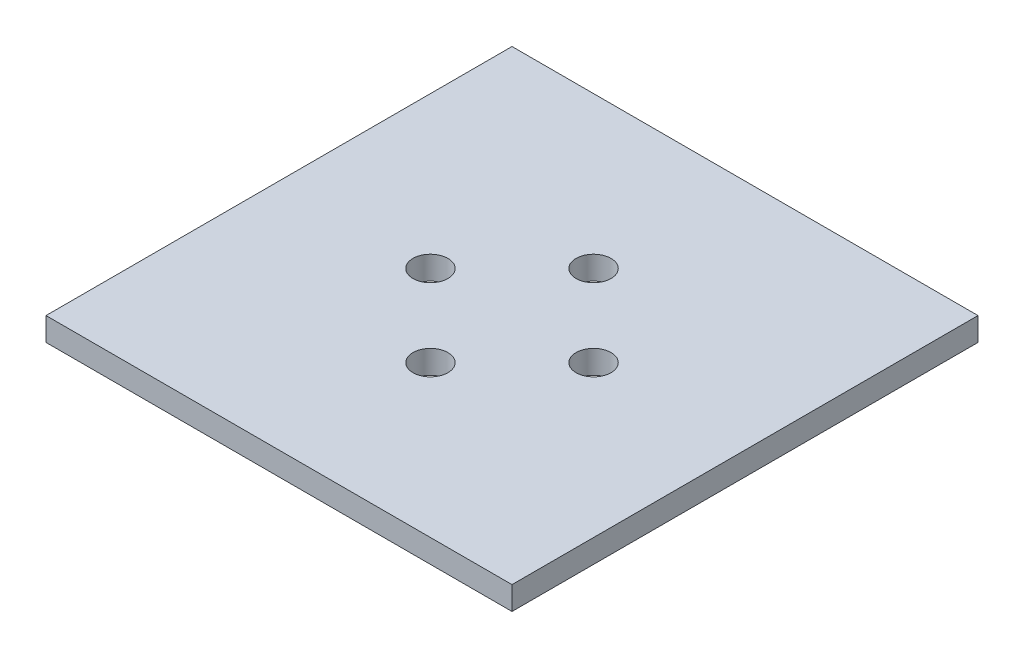
ISO-10303-21;
HEADER;
FILE_DESCRIPTION(('STEP AP214'),'2;1');
FILE_NAME('part.step','',(''),(''),'','','');
FILE_SCHEMA(('AUTOMOTIVE_DESIGN { 1 0 10303 214 1 1 1 1 }'));
ENDSEC;
DATA;
#1=APPLICATION_CONTEXT('core data for automotive mechanical design processes');
#2=APPLICATION_PROTOCOL_DEFINITION('international standard','automotive_design',2000,#1);
#3=PRODUCT_CONTEXT('',#1,'mechanical');
#4=PRODUCT('Part','Part','',(#3));
#5=PRODUCT_RELATED_PRODUCT_CATEGORY('part','',(#4));
#6=PRODUCT_DEFINITION_FORMATION('','',#4);
#7=PRODUCT_DEFINITION_CONTEXT('part definition',#1,'design');
#8=PRODUCT_DEFINITION('design','',#6,#7);
#9=PRODUCT_DEFINITION_SHAPE('','',#8);
#10=(LENGTH_UNIT() NAMED_UNIT(*) SI_UNIT(.MILLI.,.METRE.));
#11=(NAMED_UNIT(*) PLANE_ANGLE_UNIT() SI_UNIT($,.RADIAN.));
#12=(NAMED_UNIT(*) SI_UNIT($,.STERADIAN.) SOLID_ANGLE_UNIT());
#13=UNCERTAINTY_MEASURE_WITH_UNIT(LENGTH_MEASURE(1.E-05),#10,'distance_accuracy_value','');
#14=(GEOMETRIC_REPRESENTATION_CONTEXT(3) GLOBAL_UNCERTAINTY_ASSIGNED_CONTEXT((#13)) GLOBAL_UNIT_ASSIGNED_CONTEXT((#10,
#11,#12)) REPRESENTATION_CONTEXT('',''));
#15=CARTESIAN_POINT('',(0.,0.,0.));
#16=DIRECTION('',(0.,0.,1.));
#17=DIRECTION('',(1.,0.,0.));
#18=AXIS2_PLACEMENT_3D('',#15,#16,#17);
#19=CARTESIAN_POINT('',(0.,2.,0.));
#20=DIRECTION('',(0.,-1.,0.));
#21=DIRECTION('',(0.,0.,-1.));
#22=AXIS2_PLACEMENT_3D('',#19,#20,#21);
#23=PLANE('',#22);
#24=DIRECTION('',(0.,0.,1.));
#25=VECTOR('',#24,1.);
#26=CARTESIAN_POINT('',(0.,2.,0.));
#27=LINE('',#26,#25);
#28=CARTESIAN_POINT('',(0.,2.,-40.));
#29=VERTEX_POINT('',#28);
#30=CARTESIAN_POINT('',(0.,2.,0.));
#31=VERTEX_POINT('',#30);
#32=EDGE_CURVE('E87',#29,#31,#27,.T.);
#33=ORIENTED_EDGE('',*,*,#32,.T.);
#34=DIRECTION('',(1.,0.,0.));
#35=VECTOR('',#34,1.);
#36=CARTESIAN_POINT('',(0.,2.,0.));
#37=LINE('',#36,#35);
#38=CARTESIAN_POINT('',(40.,2.,0.));
#39=VERTEX_POINT('',#38);
#40=EDGE_CURVE('E82',#31,#39,#37,.T.);
#41=ORIENTED_EDGE('',*,*,#40,.T.);
#42=DIRECTION('',(0.,0.,-1.));
#43=VECTOR('',#42,1.);
#44=CARTESIAN_POINT('',(40.,2.,0.));
#45=LINE('',#44,#43);
#46=CARTESIAN_POINT('',(40.,2.,-40.));
#47=VERTEX_POINT('',#46);
#48=EDGE_CURVE('E85',#39,#47,#45,.T.);
#49=ORIENTED_EDGE('',*,*,#48,.T.);
#50=DIRECTION('',(-1.,0.,0.));
#51=VECTOR('',#50,1.);
#52=CARTESIAN_POINT('',(0.,2.,-40.));
#53=LINE('',#52,#51);
#54=EDGE_CURVE('E52',#47,#29,#53,.T.);
#55=ORIENTED_EDGE('',*,*,#54,.T.);
#56=EDGE_LOOP('',(#33,#41,#49,#55));
#57=FACE_BOUND('',#56,.T.);
#58=CARTESIAN_POINT('',(13.,2.,-20.));
#59=DIRECTION('',(0.,1.,0.));
#60=DIRECTION('',(0.,0.,1.));
#61=AXIS2_PLACEMENT_3D('',#58,#59,#60);
#62=CIRCLE('',#61,1.5);
#63=CARTESIAN_POINT('',(13.,2.,-18.5));
#64=VERTEX_POINT('',#63);
#65=EDGE_CURVE('E102',#64,#64,#62,.T.);
#66=ORIENTED_EDGE('',*,*,#65,.F.);
#67=EDGE_LOOP('',(#66));
#68=FACE_BOUND('',#67,.T.);
#69=CARTESIAN_POINT('',(20.,2.,-27.));
#70=DIRECTION('',(0.,1.,0.));
#71=DIRECTION('',(0.,0.,1.));
#72=AXIS2_PLACEMENT_3D('',#69,#70,#71);
#73=CIRCLE('',#72,1.5);
#74=CARTESIAN_POINT('',(20.,2.,-25.5));
#75=VERTEX_POINT('',#74);
#76=EDGE_CURVE('E117',#75,#75,#73,.T.);
#77=ORIENTED_EDGE('',*,*,#76,.F.);
#78=EDGE_LOOP('',(#77));
#79=FACE_BOUND('',#78,.T.);
#80=CARTESIAN_POINT('',(27.,2.,-20.));
#81=DIRECTION('',(0.,1.,0.));
#82=DIRECTION('',(0.,0.,1.));
#83=AXIS2_PLACEMENT_3D('',#80,#81,#82);
#84=CIRCLE('',#83,1.5);
#85=CARTESIAN_POINT('',(27.,2.,-18.5));
#86=VERTEX_POINT('',#85);
#87=EDGE_CURVE('E123',#86,#86,#84,.T.);
#88=ORIENTED_EDGE('',*,*,#87,.F.);
#89=EDGE_LOOP('',(#88));
#90=FACE_BOUND('',#89,.T.);
#91=CARTESIAN_POINT('',(20.,2.,-13.));
#92=DIRECTION('',(0.,1.,0.));
#93=DIRECTION('',(0.,0.,1.));
#94=AXIS2_PLACEMENT_3D('',#91,#92,#93);
#95=CIRCLE('',#94,1.5);
#96=CARTESIAN_POINT('',(20.,2.,-11.5));
#97=VERTEX_POINT('',#96);
#98=EDGE_CURVE('E129',#97,#97,#95,.T.);
#99=ORIENTED_EDGE('',*,*,#98,.F.);
#100=EDGE_LOOP('',(#99));
#101=FACE_BOUND('',#100,.T.);
#102=ADVANCED_FACE('F35',(#57,#68,#79,#90,#101),#23,.F.);
#103=CARTESIAN_POINT('',(0.,0.,0.));
#104=DIRECTION('',(0.,-1.,0.));
#105=DIRECTION('',(0.,0.,-1.));
#106=AXIS2_PLACEMENT_3D('',#103,#104,#105);
#107=PLANE('',#106);
#108=CARTESIAN_POINT('',(27.,0.,-20.));
#109=DIRECTION('',(0.,1.,0.));
#110=DIRECTION('',(0.,0.,1.));
#111=AXIS2_PLACEMENT_3D('',#108,#109,#110);
#112=CIRCLE('',#111,1.5);
#113=CARTESIAN_POINT('',(27.,0.,-18.5));
#114=VERTEX_POINT('',#113);
#115=EDGE_CURVE('E126',#114,#114,#112,.T.);
#116=ORIENTED_EDGE('',*,*,#115,.T.);
#117=EDGE_LOOP('',(#116));
#118=FACE_BOUND('',#117,.T.);
#119=CARTESIAN_POINT('',(13.,0.,-20.));
#120=DIRECTION('',(0.,1.,0.));
#121=DIRECTION('',(0.,0.,1.));
#122=AXIS2_PLACEMENT_3D('',#119,#120,#121);
#123=CIRCLE('',#122,1.5);
#124=CARTESIAN_POINT('',(13.,0.,-18.5));
#125=VERTEX_POINT('',#124);
#126=EDGE_CURVE('E114',#125,#125,#123,.T.);
#127=ORIENTED_EDGE('',*,*,#126,.T.);
#128=EDGE_LOOP('',(#127));
#129=FACE_BOUND('',#128,.T.);
#130=DIRECTION('',(0.,0.,1.));
#131=VECTOR('',#130,1.);
#132=CARTESIAN_POINT('',(0.,0.,0.));
#133=LINE('',#132,#131);
#134=CARTESIAN_POINT('',(0.,0.,-40.));
#135=VERTEX_POINT('',#134);
#136=CARTESIAN_POINT('',(0.,0.,0.));
#137=VERTEX_POINT('',#136);
#138=EDGE_CURVE('E99',#135,#137,#133,.T.);
#139=ORIENTED_EDGE('',*,*,#138,.F.);
#140=DIRECTION('',(-1.,0.,0.));
#141=VECTOR('',#140,1.);
#142=CARTESIAN_POINT('',(0.,0.,-40.));
#143=LINE('',#142,#141);
#144=CARTESIAN_POINT('',(40.,0.,-40.));
#145=VERTEX_POINT('',#144);
#146=EDGE_CURVE('E75',#145,#135,#143,.T.);
#147=ORIENTED_EDGE('',*,*,#146,.F.);
#148=DIRECTION('',(0.,0.,-1.));
#149=VECTOR('',#148,1.);
#150=CARTESIAN_POINT('',(40.,0.,0.));
#151=LINE('',#150,#149);
#152=CARTESIAN_POINT('',(40.,0.,0.));
#153=VERTEX_POINT('',#152);
#154=EDGE_CURVE('E69',#153,#145,#151,.T.);
#155=ORIENTED_EDGE('',*,*,#154,.F.);
#156=DIRECTION('',(1.,0.,0.));
#157=VECTOR('',#156,1.);
#158=CARTESIAN_POINT('',(0.,0.,0.));
#159=LINE('',#158,#157);
#160=EDGE_CURVE('E91',#137,#153,#159,.T.);
#161=ORIENTED_EDGE('',*,*,#160,.F.);
#162=EDGE_LOOP('',(#139,#147,#155,#161));
#163=FACE_BOUND('',#162,.T.);
#164=CARTESIAN_POINT('',(20.,0.,-27.));
#165=DIRECTION('',(0.,1.,0.));
#166=DIRECTION('',(0.,0.,1.));
#167=AXIS2_PLACEMENT_3D('',#164,#165,#166);
#168=CIRCLE('',#167,1.5);
#169=CARTESIAN_POINT('',(20.,0.,-25.5));
#170=VERTEX_POINT('',#169);
#171=EDGE_CURVE('E120',#170,#170,#168,.T.);
#172=ORIENTED_EDGE('',*,*,#171,.T.);
#173=EDGE_LOOP('',(#172));
#174=FACE_BOUND('',#173,.T.);
#175=CARTESIAN_POINT('',(20.,0.,-13.));
#176=DIRECTION('',(0.,1.,0.));
#177=DIRECTION('',(0.,0.,1.));
#178=AXIS2_PLACEMENT_3D('',#175,#176,#177);
#179=CIRCLE('',#178,1.5);
#180=CARTESIAN_POINT('',(20.,0.,-11.5));
#181=VERTEX_POINT('',#180);
#182=EDGE_CURVE('E132',#181,#181,#179,.T.);
#183=ORIENTED_EDGE('',*,*,#182,.T.);
#184=EDGE_LOOP('',(#183));
#185=FACE_BOUND('',#184,.T.);
#186=ADVANCED_FACE('F110',(#118,#129,#163,#174,#185),#107,.T.);
#187=CARTESIAN_POINT('',(0.,2.,0.));
#188=DIRECTION('',(1.,0.,0.));
#189=DIRECTION('',(0.,0.,-1.));
#190=AXIS2_PLACEMENT_3D('',#187,#188,#189);
#191=PLANE('',#190);
#192=ORIENTED_EDGE('',*,*,#138,.T.);
#193=DIRECTION('',(0.,-1.,0.));
#194=VECTOR('',#193,1.);
#195=CARTESIAN_POINT('',(0.,2.,0.));
#196=LINE('',#195,#194);
#197=EDGE_CURVE('E11',#31,#137,#196,.T.);
#198=ORIENTED_EDGE('',*,*,#197,.F.);
#199=ORIENTED_EDGE('',*,*,#32,.F.);
#200=DIRECTION('',(0.,-1.,0.));
#201=VECTOR('',#200,1.);
#202=CARTESIAN_POINT('',(0.,2.,-40.));
#203=LINE('',#202,#201);
#204=EDGE_CURVE('E95',#29,#135,#203,.T.);
#205=ORIENTED_EDGE('',*,*,#204,.T.);
#206=EDGE_LOOP('',(#192,#198,#199,#205));
#207=FACE_BOUND('',#206,.T.);
#208=ADVANCED_FACE('F37',(#207),#191,.F.);
#209=CARTESIAN_POINT('',(0.,2.,0.));
#210=DIRECTION('',(0.,0.,-1.));
#211=DIRECTION('',(-1.,0.,0.));
#212=AXIS2_PLACEMENT_3D('',#209,#210,#211);
#213=PLANE('',#212);
#214=ORIENTED_EDGE('',*,*,#160,.T.);
#215=DIRECTION('',(0.,-1.,0.));
#216=VECTOR('',#215,1.);
#217=CARTESIAN_POINT('',(40.,2.,0.));
#218=LINE('',#217,#216);
#219=EDGE_CURVE('E44',#39,#153,#218,.T.);
#220=ORIENTED_EDGE('',*,*,#219,.F.);
#221=ORIENTED_EDGE('',*,*,#40,.F.);
#222=ORIENTED_EDGE('',*,*,#197,.T.);
#223=EDGE_LOOP('',(#214,#220,#221,#222));
#224=FACE_BOUND('',#223,.T.);
#225=ADVANCED_FACE('F90',(#224),#213,.F.);
#226=CARTESIAN_POINT('',(40.,2.,0.));
#227=DIRECTION('',(-1.,0.,0.));
#228=DIRECTION('',(0.,0.,1.));
#229=AXIS2_PLACEMENT_3D('',#226,#227,#228);
#230=PLANE('',#229);
#231=ORIENTED_EDGE('',*,*,#154,.T.);
#232=DIRECTION('',(0.,-1.,0.));
#233=VECTOR('',#232,1.);
#234=CARTESIAN_POINT('',(40.,2.,-40.));
#235=LINE('',#234,#233);
#236=EDGE_CURVE('E92',#47,#145,#235,.T.);
#237=ORIENTED_EDGE('',*,*,#236,.F.);
#238=ORIENTED_EDGE('',*,*,#48,.F.);
#239=ORIENTED_EDGE('',*,*,#219,.T.);
#240=EDGE_LOOP('',(#231,#237,#238,#239));
#241=FACE_BOUND('',#240,.T.);
#242=ADVANCED_FACE('F93',(#241),#230,.F.);
#243=CARTESIAN_POINT('',(0.,2.,-40.));
#244=DIRECTION('',(0.,0.,1.));
#245=DIRECTION('',(1.,0.,0.));
#246=AXIS2_PLACEMENT_3D('',#243,#244,#245);
#247=PLANE('',#246);
#248=ORIENTED_EDGE('',*,*,#146,.T.);
#249=ORIENTED_EDGE('',*,*,#204,.F.);
#250=ORIENTED_EDGE('',*,*,#54,.F.);
#251=ORIENTED_EDGE('',*,*,#236,.T.);
#252=EDGE_LOOP('',(#248,#249,#250,#251));
#253=FACE_BOUND('',#252,.T.);
#254=ADVANCED_FACE('F107',(#253),#247,.F.);
#255=CARTESIAN_POINT('',(13.,2.,-20.));
#256=DIRECTION('',(0.,-1.,0.));
#257=DIRECTION('',(0.,0.,-1.));
#258=AXIS2_PLACEMENT_3D('',#255,#256,#257);
#259=CYLINDRICAL_SURFACE('',#258,1.5);
#260=ORIENTED_EDGE('',*,*,#65,.T.);
#261=EDGE_LOOP('',(#260));
#262=FACE_BOUND('',#261,.T.);
#263=ORIENTED_EDGE('',*,*,#126,.F.);
#264=EDGE_LOOP('',(#263));
#265=FACE_BOUND('',#264,.T.);
#266=ADVANCED_FACE('F149',(#262,#265),#259,.F.);
#267=CARTESIAN_POINT('',(20.,2.,-27.));
#268=DIRECTION('',(0.,-1.,0.));
#269=DIRECTION('',(0.,0.,-1.));
#270=AXIS2_PLACEMENT_3D('',#267,#268,#269);
#271=CYLINDRICAL_SURFACE('',#270,1.5);
#272=ORIENTED_EDGE('',*,*,#76,.T.);
#273=EDGE_LOOP('',(#272));
#274=FACE_BOUND('',#273,.T.);
#275=ORIENTED_EDGE('',*,*,#171,.F.);
#276=EDGE_LOOP('',(#275));
#277=FACE_BOUND('',#276,.T.);
#278=ADVANCED_FACE('F195',(#274,#277),#271,.F.);
#279=CARTESIAN_POINT('',(27.,2.,-20.));
#280=DIRECTION('',(0.,-1.,0.));
#281=DIRECTION('',(0.,0.,-1.));
#282=AXIS2_PLACEMENT_3D('',#279,#280,#281);
#283=CYLINDRICAL_SURFACE('',#282,1.5);
#284=ORIENTED_EDGE('',*,*,#87,.T.);
#285=EDGE_LOOP('',(#284));
#286=FACE_BOUND('',#285,.T.);
#287=ORIENTED_EDGE('',*,*,#115,.F.);
#288=EDGE_LOOP('',(#287));
#289=FACE_BOUND('',#288,.T.);
#290=ADVANCED_FACE('F203',(#286,#289),#283,.F.);
#291=CARTESIAN_POINT('',(20.,2.,-13.));
#292=DIRECTION('',(0.,-1.,0.));
#293=DIRECTION('',(0.,0.,-1.));
#294=AXIS2_PLACEMENT_3D('',#291,#292,#293);
#295=CYLINDRICAL_SURFACE('',#294,1.5);
#296=ORIENTED_EDGE('',*,*,#98,.T.);
#297=EDGE_LOOP('',(#296));
#298=FACE_BOUND('',#297,.T.);
#299=ORIENTED_EDGE('',*,*,#182,.F.);
#300=EDGE_LOOP('',(#299));
#301=FACE_BOUND('',#300,.T.);
#302=ADVANCED_FACE('F138',(#298,#301),#295,.F.);
#303=CLOSED_SHELL('',(#102,#186,#208,#225,#242,#254,#266,#278,#290,#302));
#304=MANIFOLD_SOLID_BREP('B2',#303);
#305=ADVANCED_BREP_SHAPE_REPRESENTATION('',(#18,#304),#14);
#306=SHAPE_DEFINITION_REPRESENTATION(#9,#305);
ENDSEC;
END-ISO-10303-21;
